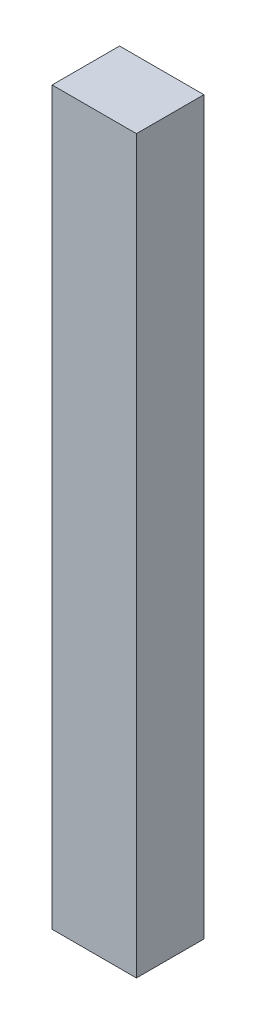
ISO-10303-21;
HEADER;
FILE_DESCRIPTION(('STEP AP214'),'2;1');
FILE_NAME('part.step','',(''),(''),'','','');
FILE_SCHEMA(('AUTOMOTIVE_DESIGN { 1 0 10303 214 1 1 1 1 }'));
ENDSEC;
DATA;
#1=APPLICATION_CONTEXT('core data for automotive mechanical design processes');
#2=APPLICATION_PROTOCOL_DEFINITION('international standard','automotive_design',2000,#1);
#3=PRODUCT_CONTEXT('',#1,'mechanical');
#4=PRODUCT('Part','Part','',(#3));
#5=PRODUCT_RELATED_PRODUCT_CATEGORY('part','',(#4));
#6=PRODUCT_DEFINITION_FORMATION('','',#4);
#7=PRODUCT_DEFINITION_CONTEXT('part definition',#1,'design');
#8=PRODUCT_DEFINITION('design','',#6,#7);
#9=PRODUCT_DEFINITION_SHAPE('','',#8);
#10=(LENGTH_UNIT() NAMED_UNIT(*) SI_UNIT(.MILLI.,.METRE.));
#11=(NAMED_UNIT(*) PLANE_ANGLE_UNIT() SI_UNIT($,.RADIAN.));
#12=(NAMED_UNIT(*) SI_UNIT($,.STERADIAN.) SOLID_ANGLE_UNIT());
#13=UNCERTAINTY_MEASURE_WITH_UNIT(LENGTH_MEASURE(1.E-05),#10,'distance_accuracy_value','');
#14=(GEOMETRIC_REPRESENTATION_CONTEXT(3) GLOBAL_UNCERTAINTY_ASSIGNED_CONTEXT((#13)) GLOBAL_UNIT_ASSIGNED_CONTEXT((#10,
#11,#12)) REPRESENTATION_CONTEXT('',''));
#15=CARTESIAN_POINT('',(0.,0.,0.));
#16=DIRECTION('',(0.,0.,1.));
#17=DIRECTION('',(1.,0.,0.));
#18=AXIS2_PLACEMENT_3D('',#15,#16,#17);
#19=CARTESIAN_POINT('',(-268.431690787297,-386.429556720008,40.));
#20=DIRECTION('',(1.,0.,0.));
#21=DIRECTION('',(0.,0.,-1.));
#22=AXIS2_PLACEMENT_3D('',#19,#20,#21);
#23=PLANE('',#22);
#24=DIRECTION('',(0.,-1.,0.));
#25=VECTOR('',#24,1.);
#26=CARTESIAN_POINT('',(-268.431690787297,-386.429556720008,0.));
#27=LINE('',#26,#25);
#28=CARTESIAN_POINT('',(-268.431690787297,-386.429556720008,0.));
#29=VERTEX_POINT('',#28);
#30=CARTESIAN_POINT('',(-268.431690787297,-820.,0.));
#31=VERTEX_POINT('',#30);
#32=EDGE_CURVE('E96',#29,#31,#27,.T.);
#33=ORIENTED_EDGE('',*,*,#32,.T.);
#34=DIRECTION('',(0.,0.,-1.));
#35=VECTOR('',#34,1.);
#36=CARTESIAN_POINT('',(-268.431690787297,-820.,40.));
#37=LINE('',#36,#35);
#38=CARTESIAN_POINT('',(-268.431690787297,-820.,40.));
#39=VERTEX_POINT('',#38);
#40=EDGE_CURVE('E11',#39,#31,#37,.T.);
#41=ORIENTED_EDGE('',*,*,#40,.F.);
#42=DIRECTION('',(0.,-1.,0.));
#43=VECTOR('',#42,1.);
#44=CARTESIAN_POINT('',(-268.431690787297,-386.429556720008,40.));
#45=LINE('',#44,#43);
#46=CARTESIAN_POINT('',(-268.431690787297,-386.429556720008,40.));
#47=VERTEX_POINT('',#46);
#48=EDGE_CURVE('E84',#47,#39,#45,.T.);
#49=ORIENTED_EDGE('',*,*,#48,.F.);
#50=DIRECTION('',(0.,0.,-1.));
#51=VECTOR('',#50,1.);
#52=CARTESIAN_POINT('',(-268.431690787297,-386.429556720008,40.));
#53=LINE('',#52,#51);
#54=EDGE_CURVE('E92',#47,#29,#53,.T.);
#55=ORIENTED_EDGE('',*,*,#54,.T.);
#56=EDGE_LOOP('',(#33,#41,#49,#55));
#57=FACE_BOUND('',#56,.T.);
#58=ADVANCED_FACE('F33',(#57),#23,.F.);
#59=CARTESIAN_POINT('',(-268.431690787297,-820.,40.));
#60=DIRECTION('',(0.,1.,0.));
#61=DIRECTION('',(0.,0.,1.));
#62=AXIS2_PLACEMENT_3D('',#59,#60,#61);
#63=PLANE('',#62);
#64=DIRECTION('',(1.,0.,0.));
#65=VECTOR('',#64,1.);
#66=CARTESIAN_POINT('',(-268.431690787297,-820.,0.));
#67=LINE('',#66,#65);
#68=CARTESIAN_POINT('',(-218.431690787297,-820.,0.));
#69=VERTEX_POINT('',#68);
#70=EDGE_CURVE('E88',#31,#69,#67,.T.);
#71=ORIENTED_EDGE('',*,*,#70,.T.);
#72=DIRECTION('',(0.,0.,-1.));
#73=VECTOR('',#72,1.);
#74=CARTESIAN_POINT('',(-218.431690787297,-820.,40.));
#75=LINE('',#74,#73);
#76=CARTESIAN_POINT('',(-218.431690787297,-820.,40.));
#77=VERTEX_POINT('',#76);
#78=EDGE_CURVE('E41',#77,#69,#75,.T.);
#79=ORIENTED_EDGE('',*,*,#78,.F.);
#80=DIRECTION('',(1.,0.,0.));
#81=VECTOR('',#80,1.);
#82=CARTESIAN_POINT('',(-268.431690787297,-820.,40.));
#83=LINE('',#82,#81);
#84=EDGE_CURVE('E79',#39,#77,#83,.T.);
#85=ORIENTED_EDGE('',*,*,#84,.F.);
#86=ORIENTED_EDGE('',*,*,#40,.T.);
#87=EDGE_LOOP('',(#71,#79,#85,#86));
#88=FACE_BOUND('',#87,.T.);
#89=ADVANCED_FACE('F87',(#88),#63,.F.);
#90=CARTESIAN_POINT('',(-218.431690787297,-386.429556720008,40.));
#91=DIRECTION('',(-1.,0.,0.));
#92=DIRECTION('',(0.,-1.,0.));
#93=AXIS2_PLACEMENT_3D('',#90,#91,#92);
#94=PLANE('',#93);
#95=DIRECTION('',(0.,1.,0.));
#96=VECTOR('',#95,1.);
#97=CARTESIAN_POINT('',(-218.431690787297,-386.429556720008,0.));
#98=LINE('',#97,#96);
#99=CARTESIAN_POINT('',(-218.431690787297,-386.429556720008,0.));
#100=VERTEX_POINT('',#99);
#101=EDGE_CURVE('E66',#69,#100,#98,.T.);
#102=ORIENTED_EDGE('',*,*,#101,.T.);
#103=DIRECTION('',(0.,0.,-1.));
#104=VECTOR('',#103,1.);
#105=CARTESIAN_POINT('',(-218.431690787297,-386.429556720008,40.));
#106=LINE('',#105,#104);
#107=CARTESIAN_POINT('',(-218.431690787297,-386.429556720008,40.));
#108=VERTEX_POINT('',#107);
#109=EDGE_CURVE('E89',#108,#100,#106,.T.);
#110=ORIENTED_EDGE('',*,*,#109,.F.);
#111=DIRECTION('',(0.,1.,0.));
#112=VECTOR('',#111,1.);
#113=CARTESIAN_POINT('',(-218.431690787297,-386.429556720008,40.));
#114=LINE('',#113,#112);
#115=EDGE_CURVE('E82',#77,#108,#114,.T.);
#116=ORIENTED_EDGE('',*,*,#115,.F.);
#117=ORIENTED_EDGE('',*,*,#78,.T.);
#118=EDGE_LOOP('',(#102,#110,#116,#117));
#119=FACE_BOUND('',#118,.T.);
#120=ADVANCED_FACE('F90',(#119),#94,.F.);
#121=CARTESIAN_POINT('',(-268.431690787297,-386.429556720008,40.));
#122=DIRECTION('',(0.,-1.,0.));
#123=DIRECTION('',(0.,0.,-1.));
#124=AXIS2_PLACEMENT_3D('',#121,#122,#123);
#125=PLANE('',#124);
#126=DIRECTION('',(-1.,0.,0.));
#127=VECTOR('',#126,1.);
#128=CARTESIAN_POINT('',(-268.431690787297,-386.429556720008,0.));
#129=LINE('',#128,#127);
#130=EDGE_CURVE('E72',#100,#29,#129,.T.);
#131=ORIENTED_EDGE('',*,*,#130,.T.);
#132=ORIENTED_EDGE('',*,*,#54,.F.);
#133=DIRECTION('',(-1.,0.,0.));
#134=VECTOR('',#133,1.);
#135=CARTESIAN_POINT('',(-268.431690787297,-386.429556720008,40.));
#136=LINE('',#135,#134);
#137=EDGE_CURVE('E49',#108,#47,#136,.T.);
#138=ORIENTED_EDGE('',*,*,#137,.F.);
#139=ORIENTED_EDGE('',*,*,#109,.T.);
#140=EDGE_LOOP('',(#131,#132,#138,#139));
#141=FACE_BOUND('',#140,.T.);
#142=ADVANCED_FACE('F103',(#141),#125,.F.);
#143=CARTESIAN_POINT('',(0.,0.,40.));
#144=DIRECTION('',(0.,0.,1.));
#145=DIRECTION('',(1.,0.,0.));
#146=AXIS2_PLACEMENT_3D('',#143,#144,#145);
#147=PLANE('',#146);
#148=ORIENTED_EDGE('',*,*,#48,.T.);
#149=ORIENTED_EDGE('',*,*,#84,.T.);
#150=ORIENTED_EDGE('',*,*,#115,.T.);
#151=ORIENTED_EDGE('',*,*,#137,.T.);
#152=EDGE_LOOP('',(#148,#149,#150,#151));
#153=FACE_BOUND('',#152,.T.);
#154=ADVANCED_FACE('F80',(#153),#147,.T.);
#155=CARTESIAN_POINT('',(0.,0.,0.));
#156=DIRECTION('',(0.,0.,1.));
#157=DIRECTION('',(1.,0.,0.));
#158=AXIS2_PLACEMENT_3D('',#155,#156,#157);
#159=PLANE('',#158);
#160=ORIENTED_EDGE('',*,*,#32,.F.);
#161=ORIENTED_EDGE('',*,*,#130,.F.);
#162=ORIENTED_EDGE('',*,*,#101,.F.);
#163=ORIENTED_EDGE('',*,*,#70,.F.);
#164=EDGE_LOOP('',(#160,#161,#162,#163));
#165=FACE_BOUND('',#164,.T.);
#166=ADVANCED_FACE('F106',(#165),#159,.F.);
#167=CLOSED_SHELL('',(#58,#89,#120,#142,#154,#166));
#168=MANIFOLD_SOLID_BREP('B2',#167);
#169=ADVANCED_BREP_SHAPE_REPRESENTATION('',(#18,#168),#14);
#170=SHAPE_DEFINITION_REPRESENTATION(#9,#169);
ENDSEC;
END-ISO-10303-21;
